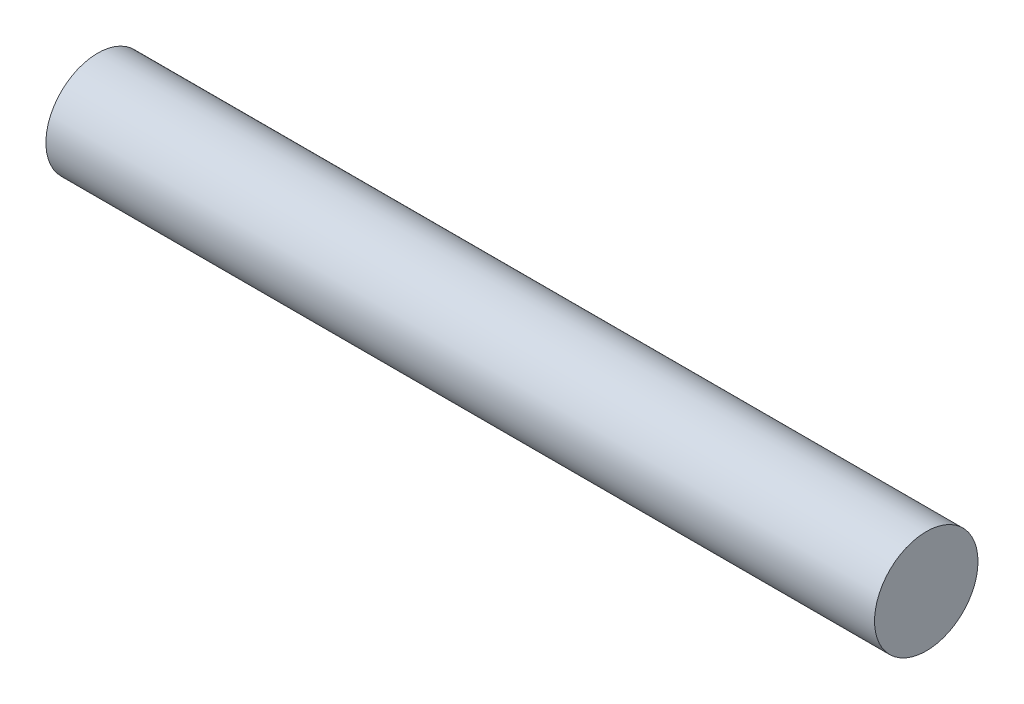
ISO-10303-21;
HEADER;
FILE_DESCRIPTION(('STEP AP214'),'2;1');
FILE_NAME('part.step','',(''),(''),'','','');
FILE_SCHEMA(('AUTOMOTIVE_DESIGN { 1 0 10303 214 1 1 1 1 }'));
ENDSEC;
DATA;
#1=APPLICATION_CONTEXT('core data for automotive mechanical design processes');
#2=APPLICATION_PROTOCOL_DEFINITION('international standard','automotive_design',2000,#1);
#3=PRODUCT_CONTEXT('',#1,'mechanical');
#4=PRODUCT('Part','Part','',(#3));
#5=PRODUCT_RELATED_PRODUCT_CATEGORY('part','',(#4));
#6=PRODUCT_DEFINITION_FORMATION('','',#4);
#7=PRODUCT_DEFINITION_CONTEXT('part definition',#1,'design');
#8=PRODUCT_DEFINITION('design','',#6,#7);
#9=PRODUCT_DEFINITION_SHAPE('','',#8);
#10=(LENGTH_UNIT() NAMED_UNIT(*) SI_UNIT(.MILLI.,.METRE.));
#11=(NAMED_UNIT(*) PLANE_ANGLE_UNIT() SI_UNIT($,.RADIAN.));
#12=(NAMED_UNIT(*) SI_UNIT($,.STERADIAN.) SOLID_ANGLE_UNIT());
#13=UNCERTAINTY_MEASURE_WITH_UNIT(LENGTH_MEASURE(1.E-05),#10,'distance_accuracy_value','');
#14=(GEOMETRIC_REPRESENTATION_CONTEXT(3) GLOBAL_UNCERTAINTY_ASSIGNED_CONTEXT((#13)) GLOBAL_UNIT_ASSIGNED_CONTEXT((#10,
#11,#12)) REPRESENTATION_CONTEXT('',''));
#15=CARTESIAN_POINT('',(0.,0.,0.));
#16=DIRECTION('',(0.,0.,1.));
#17=DIRECTION('',(1.,0.,0.));
#18=AXIS2_PLACEMENT_3D('',#15,#16,#17);
#19=CARTESIAN_POINT('',(8.00860927532029,0.,0.));
#20=DIRECTION('',(-1.,0.,0.));
#21=DIRECTION('',(0.,0.,1.));
#22=AXIS2_PLACEMENT_3D('',#19,#20,#21);
#23=CYLINDRICAL_SURFACE('',#22,1.);
#24=CARTESIAN_POINT('',(8.00860927532029,0.,0.));
#25=DIRECTION('',(1.,0.,0.));
#26=DIRECTION('',(0.,0.,-1.));
#27=AXIS2_PLACEMENT_3D('',#24,#25,#26);
#28=CIRCLE('',#27,1.);
#29=CARTESIAN_POINT('',(8.00860927532029,0.,-1.));
#30=VERTEX_POINT('',#29);
#31=EDGE_CURVE('E10',#30,#30,#28,.T.);
#32=ORIENTED_EDGE('',*,*,#31,.F.);
#33=EDGE_LOOP('',(#32));
#34=FACE_BOUND('',#33,.T.);
#35=CARTESIAN_POINT('',(-8.00860927532029,0.,0.));
#36=DIRECTION('',(1.,0.,0.));
#37=DIRECTION('',(0.,0.,-1.));
#38=AXIS2_PLACEMENT_3D('',#35,#36,#37);
#39=CIRCLE('',#38,1.);
#40=CARTESIAN_POINT('',(-8.00860927532029,0.,-1.));
#41=VERTEX_POINT('',#40);
#42=EDGE_CURVE('E48',#41,#41,#39,.T.);
#43=ORIENTED_EDGE('',*,*,#42,.T.);
#44=EDGE_LOOP('',(#43));
#45=FACE_BOUND('',#44,.T.);
#46=ADVANCED_FACE('F45',(#34,#45),#23,.T.);
#47=CARTESIAN_POINT('',(8.00860927532029,0.,0.));
#48=DIRECTION('',(1.,0.,0.));
#49=DIRECTION('',(0.,0.,-1.));
#50=AXIS2_PLACEMENT_3D('',#47,#48,#49);
#51=PLANE('',#50);
#52=ORIENTED_EDGE('',*,*,#31,.T.);
#53=EDGE_LOOP('',(#52));
#54=FACE_BOUND('',#53,.T.);
#55=ADVANCED_FACE('F62',(#54),#51,.T.);
#56=CARTESIAN_POINT('',(-8.00860927532029,0.,0.));
#57=DIRECTION('',(1.,0.,0.));
#58=DIRECTION('',(0.,0.,-1.));
#59=AXIS2_PLACEMENT_3D('',#56,#57,#58);
#60=PLANE('',#59);
#61=ORIENTED_EDGE('',*,*,#42,.F.);
#62=EDGE_LOOP('',(#61));
#63=FACE_BOUND('',#62,.T.);
#64=ADVANCED_FACE('F60',(#63),#60,.F.);
#65=CLOSED_SHELL('',(#46,#55,#64));
#66=MANIFOLD_SOLID_BREP('B2',#65);
#67=ADVANCED_BREP_SHAPE_REPRESENTATION('',(#18,#66),#14);
#68=SHAPE_DEFINITION_REPRESENTATION(#9,#67);
ENDSEC;
END-ISO-10303-21;
